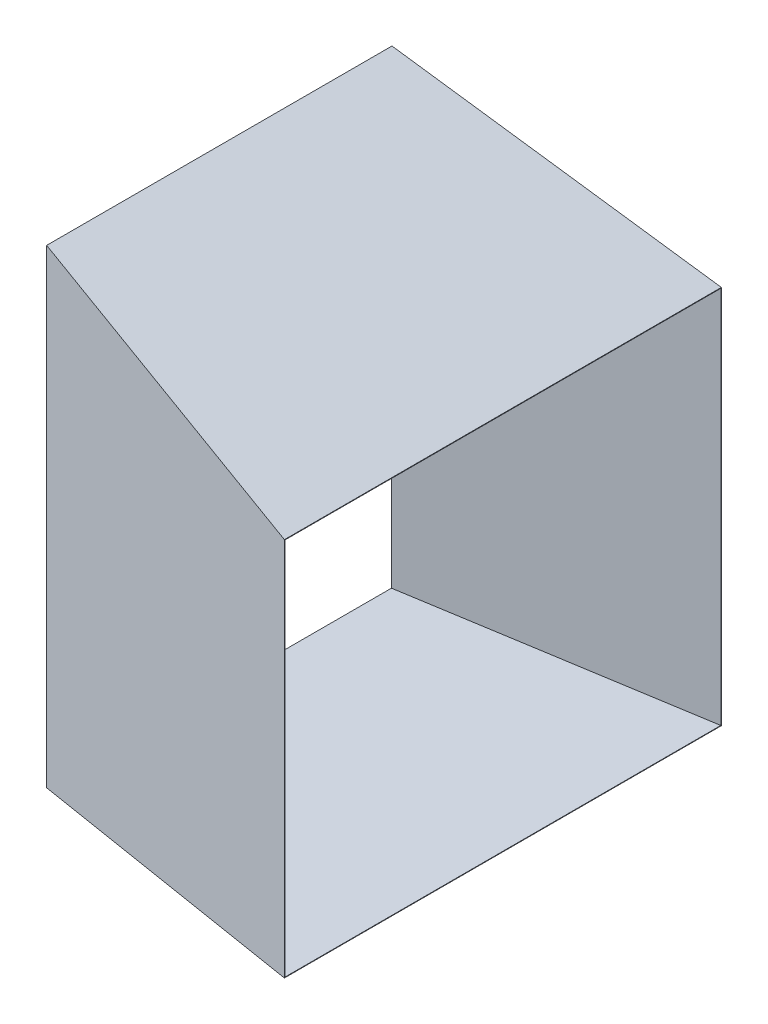
ISO-10303-21;
HEADER;
FILE_DESCRIPTION(('STEP AP214'),'2;1');
FILE_NAME('part.step','',(''),(''),'','','');
FILE_SCHEMA(('AUTOMOTIVE_DESIGN { 1 0 10303 214 1 1 1 1 }'));
ENDSEC;
DATA;
#1=APPLICATION_CONTEXT('core data for automotive mechanical design processes');
#2=APPLICATION_PROTOCOL_DEFINITION('international standard','automotive_design',2000,#1);
#3=PRODUCT_CONTEXT('',#1,'mechanical');
#4=PRODUCT('Part','Part','',(#3));
#5=PRODUCT_RELATED_PRODUCT_CATEGORY('part','',(#4));
#6=PRODUCT_DEFINITION_FORMATION('','',#4);
#7=PRODUCT_DEFINITION_CONTEXT('part definition',#1,'design');
#8=PRODUCT_DEFINITION('design','',#6,#7);
#9=PRODUCT_DEFINITION_SHAPE('','',#8);
#10=(LENGTH_UNIT() NAMED_UNIT(*) SI_UNIT(.MILLI.,.METRE.));
#11=(NAMED_UNIT(*) PLANE_ANGLE_UNIT() SI_UNIT($,.RADIAN.));
#12=(NAMED_UNIT(*) SI_UNIT($,.STERADIAN.) SOLID_ANGLE_UNIT());
#13=UNCERTAINTY_MEASURE_WITH_UNIT(LENGTH_MEASURE(1.E-05),#10,'distance_accuracy_value','');
#14=(GEOMETRIC_REPRESENTATION_CONTEXT(3) GLOBAL_UNCERTAINTY_ASSIGNED_CONTEXT((#13)) GLOBAL_UNIT_ASSIGNED_CONTEXT((#10,
#11,#12)) REPRESENTATION_CONTEXT('',''));
#15=CARTESIAN_POINT('',(0.,0.,0.));
#16=DIRECTION('',(0.,0.,1.));
#17=DIRECTION('',(1.,0.,0.));
#18=AXIS2_PLACEMENT_3D('',#15,#16,#17);
#19=CARTESIAN_POINT('',(-3.33066907387547E-13,2235.,-1039.25));
#20=DIRECTION('',(-1.,0.,0.));
#21=DIRECTION('',(0.,-1.,0.));
#22=AXIS2_PLACEMENT_3D('',#19,#20,#21);
#23=PLANE('',#22);
#24=DIRECTION('',(0.,-1.,0.));
#25=VECTOR('',#24,1.);
#26=CARTESIAN_POINT('',(0.,4942.25,821.33));
#27=LINE('',#26,#25);
#28=CARTESIAN_POINT('',(0.,2235.,821.33));
#29=VERTEX_POINT('',#28);
#30=CARTESIAN_POINT('',(0.,0.,821.33));
#31=VERTEX_POINT('',#30);
#32=EDGE_CURVE('E157',#29,#31,#27,.T.);
#33=ORIENTED_EDGE('',*,*,#32,.F.);
#34=DIRECTION('',(0.,0.,1.));
#35=VECTOR('',#34,1.);
#36=CARTESIAN_POINT('',(-3.33066907387547E-13,2235.,-1039.25));
#37=LINE('',#36,#35);
#38=CARTESIAN_POINT('',(2.22044604925031E-13,2235.,-821.33));
#39=VERTEX_POINT('',#38);
#40=EDGE_CURVE('E11',#39,#29,#37,.T.);
#41=ORIENTED_EDGE('',*,*,#40,.F.);
#42=DIRECTION('',(0.,-1.,0.));
#43=VECTOR('',#42,1.);
#44=CARTESIAN_POINT('',(2.22044604925031E-13,4942.25,-821.33));
#45=LINE('',#44,#43);
#46=CARTESIAN_POINT('',(2.22044604925031E-13,0.,-821.33));
#47=VERTEX_POINT('',#46);
#48=EDGE_CURVE('E158',#39,#47,#45,.T.);
#49=ORIENTED_EDGE('',*,*,#48,.T.);
#50=DIRECTION('',(0.,0.,1.));
#51=VECTOR('',#50,1.);
#52=CARTESIAN_POINT('',(0.,0.,-1039.25));
#53=LINE('',#52,#51);
#54=EDGE_CURVE('E42',#47,#31,#53,.T.);
#55=ORIENTED_EDGE('',*,*,#54,.T.);
#56=EDGE_LOOP('',(#33,#41,#49,#55));
#57=FACE_BOUND('',#56,.T.);
#58=DIRECTION('',(0.,0.,1.));
#59=VECTOR('',#58,1.);
#60=CARTESIAN_POINT('',(-2.22044604925031E-13,2232.37662849745,-1039.25));
#61=LINE('',#60,#59);
#62=CARTESIAN_POINT('',(-3.32675964106436E-13,2232.37662849745,-818.797590352151));
#63=VERTEX_POINT('',#62);
#64=CARTESIAN_POINT('',(-3.32675964106436E-13,2232.37662849745,818.797590352151));
#65=VERTEX_POINT('',#64);
#66=EDGE_CURVE('E126',#63,#65,#61,.T.);
#67=ORIENTED_EDGE('',*,*,#66,.T.);
#68=DIRECTION('',(0.,-1.,0.));
#69=VECTOR('',#68,1.);
#70=CARTESIAN_POINT('',(-3.33066907387547E-13,2235.,818.79759035215));
#71=LINE('',#70,#69);
#72=CARTESIAN_POINT('',(0.,2.5,818.797590352151));
#73=VERTEX_POINT('',#72);
#74=EDGE_CURVE('E112',#65,#73,#71,.T.);
#75=ORIENTED_EDGE('',*,*,#74,.T.);
#76=DIRECTION('',(0.,0.,1.));
#77=VECTOR('',#76,1.);
#78=CARTESIAN_POINT('',(0.,2.49999999999995,-1039.25));
#79=LINE('',#78,#77);
#80=CARTESIAN_POINT('',(0.,2.5,-818.797590352151));
#81=VERTEX_POINT('',#80);
#82=EDGE_CURVE('E135',#81,#73,#79,.T.);
#83=ORIENTED_EDGE('',*,*,#82,.F.);
#84=DIRECTION('',(0.,-1.,0.));
#85=VECTOR('',#84,1.);
#86=CARTESIAN_POINT('',(-6.66133814775094E-13,4942.25,-818.797590352151));
#87=LINE('',#86,#85);
#88=EDGE_CURVE('E56',#63,#81,#87,.T.);
#89=ORIENTED_EDGE('',*,*,#88,.F.);
#90=EDGE_LOOP('',(#67,#75,#83,#89));
#91=FACE_BOUND('',#90,.T.);
#92=ADVANCED_FACE('F39',(#57,#91),#23,.T.);
#93=CARTESIAN_POINT('',(1349.,1806.,-1039.25));
#94=DIRECTION('',(0.30305786171331,0.952972157229033,0.));
#95=DIRECTION('',(-0.952972157229033,0.30305786171331,0.));
#96=AXIS2_PLACEMENT_3D('',#93,#94,#95);
#97=PLANE('',#96);
#98=DIRECTION('',(-0.941876724233713,0.299529365972026,-0.152152539469986));
#99=VECTOR('',#98,1.);
#100=CARTESIAN_POINT('',(1051.13237764674,1900.72587842072,991.131903437196));
#101=LINE('',#100,#99);
#102=CARTESIAN_POINT('',(1349.,1806.,1039.25));
#103=VERTEX_POINT('',#102);
#104=EDGE_CURVE('E161',#103,#29,#101,.T.);
#105=ORIENTED_EDGE('',*,*,#104,.F.);
#106=DIRECTION('',(0.,0.,1.));
#107=VECTOR('',#106,1.);
#108=CARTESIAN_POINT('',(1349.,1806.,-1039.25));
#109=LINE('',#108,#107);
#110=CARTESIAN_POINT('',(1349.,1806.,-1039.25));
#111=VERTEX_POINT('',#110);
#112=EDGE_CURVE('E48',#111,#103,#109,.T.);
#113=ORIENTED_EDGE('',*,*,#112,.F.);
#114=DIRECTION('',(0.941876724233713,-0.299529365972026,-0.152152539469985));
#115=VECTOR('',#114,1.);
#116=CARTESIAN_POINT('',(1349.,1806.,-1039.25));
#117=LINE('',#116,#115);
#118=EDGE_CURVE('E169',#39,#111,#117,.T.);
#119=ORIENTED_EDGE('',*,*,#118,.F.);
#120=ORIENTED_EDGE('',*,*,#40,.T.);
#121=EDGE_LOOP('',(#105,#113,#119,#120));
#122=FACE_BOUND('',#121,.T.);
#123=ADVANCED_FACE('F202',(#122),#97,.T.);
#124=CARTESIAN_POINT('',(1349.,1806.,-1039.25));
#125=DIRECTION('',(1.,0.,0.));
#126=DIRECTION('',(0.,1.,0.));
#127=AXIS2_PLACEMENT_3D('',#124,#125,#126);
#128=PLANE('',#127);
#129=DIRECTION('',(0.,0.,1.));
#130=VECTOR('',#129,1.);
#131=CARTESIAN_POINT('',(1349.,1803.37662849745,-1039.25));
#132=LINE('',#131,#130);
#133=CARTESIAN_POINT('',(1349.,1803.37662849745,-1036.71759035215));
#134=VERTEX_POINT('',#133);
#135=CARTESIAN_POINT('',(1349.,1803.37662849745,1036.71759035215));
#136=VERTEX_POINT('',#135);
#137=EDGE_CURVE('E120',#134,#136,#132,.T.);
#138=ORIENTED_EDGE('',*,*,#137,.F.);
#139=DIRECTION('',(0.,1.,0.));
#140=VECTOR('',#139,1.);
#141=CARTESIAN_POINT('',(1349.,4942.25,-1036.71759035215));
#142=LINE('',#141,#140);
#143=CARTESIAN_POINT('',(1349.,2.5,-1036.71759035215));
#144=VERTEX_POINT('',#143);
#145=EDGE_CURVE('E131',#144,#134,#142,.T.);
#146=ORIENTED_EDGE('',*,*,#145,.F.);
#147=DIRECTION('',(0.,0.,1.));
#148=VECTOR('',#147,1.);
#149=CARTESIAN_POINT('',(1349.,2.5,-1039.25));
#150=LINE('',#149,#148);
#151=CARTESIAN_POINT('',(1349.,2.5,1036.71759035215));
#152=VERTEX_POINT('',#151);
#153=EDGE_CURVE('E63',#144,#152,#150,.T.);
#154=ORIENTED_EDGE('',*,*,#153,.T.);
#155=DIRECTION('',(0.,1.,0.));
#156=VECTOR('',#155,1.);
#157=CARTESIAN_POINT('',(1349.,1806.,1036.71759035215));
#158=LINE('',#157,#156);
#159=EDGE_CURVE('E110',#152,#136,#158,.T.);
#160=ORIENTED_EDGE('',*,*,#159,.T.);
#161=EDGE_LOOP('',(#138,#146,#154,#160));
#162=FACE_BOUND('',#161,.T.);
#163=ORIENTED_EDGE('',*,*,#112,.T.);
#164=DIRECTION('',(0.,1.,0.));
#165=VECTOR('',#164,1.);
#166=CARTESIAN_POINT('',(1349.,1806.,1039.25));
#167=LINE('',#166,#165);
#168=CARTESIAN_POINT('',(1349.,0.,1039.25));
#169=VERTEX_POINT('',#168);
#170=EDGE_CURVE('E172',#169,#103,#167,.T.);
#171=ORIENTED_EDGE('',*,*,#170,.F.);
#172=DIRECTION('',(0.,0.,1.));
#173=VECTOR('',#172,1.);
#174=CARTESIAN_POINT('',(1349.,0.,-1039.25));
#175=LINE('',#174,#173);
#176=CARTESIAN_POINT('',(1349.,0.,-1039.25));
#177=VERTEX_POINT('',#176);
#178=EDGE_CURVE('E181',#177,#169,#175,.T.);
#179=ORIENTED_EDGE('',*,*,#178,.F.);
#180=DIRECTION('',(0.,1.,0.));
#181=VECTOR('',#180,1.);
#182=CARTESIAN_POINT('',(1349.,1806.,-1039.25));
#183=LINE('',#182,#181);
#184=EDGE_CURVE('E175',#177,#111,#183,.T.);
#185=ORIENTED_EDGE('',*,*,#184,.T.);
#186=EDGE_LOOP('',(#163,#171,#179,#185));
#187=FACE_BOUND('',#186,.T.);
#188=ADVANCED_FACE('F128',(#162,#187),#128,.T.);
#189=CARTESIAN_POINT('',(0.,0.,-1039.25));
#190=DIRECTION('',(0.,-1.,0.));
#191=DIRECTION('',(0.,0.,-1.));
#192=AXIS2_PLACEMENT_3D('',#189,#190,#191);
#193=PLANE('',#192);
#194=DIRECTION('',(0.987202051659861,0.,0.159474478204386));
#195=VECTOR('',#194,1.);
#196=CARTESIAN_POINT('',(1349.,0.,1039.25));
#197=LINE('',#196,#195);
#198=EDGE_CURVE('E154',#31,#169,#197,.T.);
#199=ORIENTED_EDGE('',*,*,#198,.F.);
#200=ORIENTED_EDGE('',*,*,#54,.F.);
#201=DIRECTION('',(-0.987202051659861,0.,0.159474478204386));
#202=VECTOR('',#201,1.);
#203=CARTESIAN_POINT('',(1349.,0.,-1039.25));
#204=LINE('',#203,#202);
#205=EDGE_CURVE('E144',#177,#47,#204,.T.);
#206=ORIENTED_EDGE('',*,*,#205,.F.);
#207=ORIENTED_EDGE('',*,*,#178,.T.);
#208=EDGE_LOOP('',(#199,#200,#206,#207));
#209=FACE_BOUND('',#208,.T.);
#210=ADVANCED_FACE('F196',(#209),#193,.T.);
#211=CARTESIAN_POINT('',(1349.,4942.25,1039.25));
#212=DIRECTION('',(0.159474478204386,0.,-0.987202051659861));
#213=DIRECTION('',(-0.987202051659861,0.,-0.159474478204386));
#214=AXIS2_PLACEMENT_3D('',#211,#212,#213);
#215=PLANE('',#214);
#216=ORIENTED_EDGE('',*,*,#104,.T.);
#217=ORIENTED_EDGE('',*,*,#32,.T.);
#218=ORIENTED_EDGE('',*,*,#198,.T.);
#219=ORIENTED_EDGE('',*,*,#170,.T.);
#220=EDGE_LOOP('',(#216,#217,#218,#219));
#221=FACE_BOUND('',#220,.T.);
#222=ADVANCED_FACE('F198',(#221),#215,.F.);
#223=CARTESIAN_POINT('',(1349.,4942.25,-1039.25));
#224=DIRECTION('',(0.159474478204386,0.,0.987202051659861));
#225=DIRECTION('',(0.987202051659861,0.,-0.159474478204386));
#226=AXIS2_PLACEMENT_3D('',#223,#224,#225);
#227=PLANE('',#226);
#228=ORIENTED_EDGE('',*,*,#118,.T.);
#229=ORIENTED_EDGE('',*,*,#184,.F.);
#230=ORIENTED_EDGE('',*,*,#205,.T.);
#231=ORIENTED_EDGE('',*,*,#48,.F.);
#232=EDGE_LOOP('',(#228,#229,#230,#231));
#233=FACE_BOUND('',#232,.T.);
#234=ADVANCED_FACE('F205',(#233),#227,.F.);
#235=CARTESIAN_POINT('',(1348.24235534572,1803.61756960693,-1039.25));
#236=DIRECTION('',(0.30305786171331,0.952972157229033,0.));
#237=DIRECTION('',(-0.952972157229033,0.30305786171331,0.));
#238=AXIS2_PLACEMENT_3D('',#235,#236,#237);
#239=PLANE('',#238);
#240=DIRECTION('',(-0.941876724233713,0.299529365972026,-0.152152539469986));
#241=VECTOR('',#240,1.);
#242=CARTESIAN_POINT('',(1050.75518969646,1898.22245771926,988.53856213766));
#243=LINE('',#242,#241);
#244=EDGE_CURVE('E106',#136,#65,#243,.T.);
#245=ORIENTED_EDGE('',*,*,#244,.T.);
#246=ORIENTED_EDGE('',*,*,#66,.F.);
#247=DIRECTION('',(0.941876724233713,-0.299529365972026,-0.152152539469985));
#248=VECTOR('',#247,1.);
#249=CARTESIAN_POINT('',(1348.62281204972,1803.49657929854,-1036.65665870046));
#250=LINE('',#249,#248);
#251=EDGE_CURVE('E117',#63,#134,#250,.T.);
#252=ORIENTED_EDGE('',*,*,#251,.T.);
#253=ORIENTED_EDGE('',*,*,#137,.T.);
#254=EDGE_LOOP('',(#245,#246,#252,#253));
#255=FACE_BOUND('',#254,.T.);
#256=ADVANCED_FACE('F121',(#255),#239,.F.);
#257=CARTESIAN_POINT('',(0.,2.5,-1039.25));
#258=DIRECTION('',(0.,-1.,0.));
#259=DIRECTION('',(0.,0.,-1.));
#260=AXIS2_PLACEMENT_3D('',#257,#258,#259);
#261=PLANE('',#260);
#262=DIRECTION('',(0.987202051659861,0.,0.159474478204386));
#263=VECTOR('',#262,1.);
#264=CARTESIAN_POINT('',(-292.518994904696,2.5,771.543521138191));
#265=LINE('',#264,#263);
#266=EDGE_CURVE('E147',#73,#152,#265,.T.);
#267=ORIENTED_EDGE('',*,*,#266,.T.);
#268=ORIENTED_EDGE('',*,*,#153,.F.);
#269=DIRECTION('',(-0.987202051659861,0.,0.159474478204386));
#270=VECTOR('',#269,1.);
#271=CARTESIAN_POINT('',(34.70660150437,2.5,-824.404160107401));
#272=LINE('',#271,#270);
#273=EDGE_CURVE('E148',#144,#81,#272,.T.);
#274=ORIENTED_EDGE('',*,*,#273,.T.);
#275=ORIENTED_EDGE('',*,*,#82,.T.);
#276=EDGE_LOOP('',(#267,#268,#274,#275));
#277=FACE_BOUND('',#276,.T.);
#278=ADVANCED_FACE('F212',(#277),#261,.F.);
#279=CARTESIAN_POINT('',(1349.39868619551,4942.25,1036.78199487085));
#280=DIRECTION('',(0.159474478204386,0.,-0.987202051659861));
#281=DIRECTION('',(-0.987202051659861,0.,-0.159474478204386));
#282=AXIS2_PLACEMENT_3D('',#279,#280,#281);
#283=PLANE('',#282);
#284=ORIENTED_EDGE('',*,*,#244,.F.);
#285=ORIENTED_EDGE('',*,*,#159,.F.);
#286=ORIENTED_EDGE('',*,*,#266,.F.);
#287=ORIENTED_EDGE('',*,*,#74,.F.);
#288=EDGE_LOOP('',(#284,#285,#286,#287));
#289=FACE_BOUND('',#288,.T.);
#290=ADVANCED_FACE('F108',(#289),#283,.T.);
#291=CARTESIAN_POINT('',(1349.39868619551,4942.25,-1036.78199487085));
#292=DIRECTION('',(0.159474478204386,0.,0.987202051659861));
#293=DIRECTION('',(0.987202051659861,0.,-0.159474478204386));
#294=AXIS2_PLACEMENT_3D('',#291,#292,#293);
#295=PLANE('',#294);
#296=ORIENTED_EDGE('',*,*,#251,.F.);
#297=ORIENTED_EDGE('',*,*,#88,.T.);
#298=ORIENTED_EDGE('',*,*,#273,.F.);
#299=ORIENTED_EDGE('',*,*,#145,.T.);
#300=EDGE_LOOP('',(#296,#297,#298,#299));
#301=FACE_BOUND('',#300,.T.);
#302=ADVANCED_FACE('F269',(#301),#295,.T.);
#303=CLOSED_SHELL('',(#92,#123,#188,#210,#222,#234,#256,#278,#290,#302));
#304=MANIFOLD_SOLID_BREP('B2',#303);
#305=ADVANCED_BREP_SHAPE_REPRESENTATION('',(#18,#304),#14);
#306=SHAPE_DEFINITION_REPRESENTATION(#9,#305);
ENDSEC;
END-ISO-10303-21;
